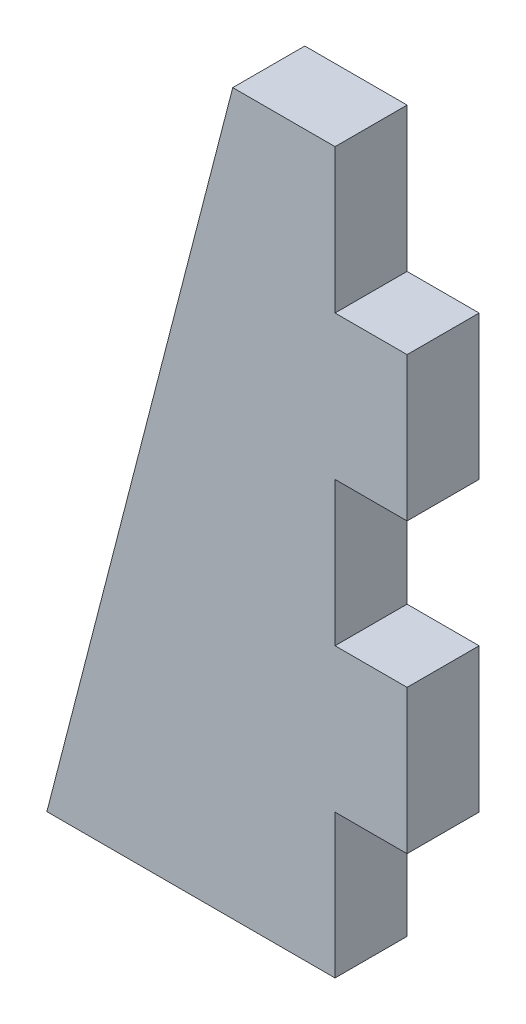
ISO-10303-21;
HEADER;
FILE_DESCRIPTION(('STEP AP214'),'2;1');
FILE_NAME('part.step','',(''),(''),'','','');
FILE_SCHEMA(('AUTOMOTIVE_DESIGN { 1 0 10303 214 1 1 1 1 }'));
ENDSEC;
DATA;
#1=APPLICATION_CONTEXT('core data for automotive mechanical design processes');
#2=APPLICATION_PROTOCOL_DEFINITION('international standard','automotive_design',2000,#1);
#3=PRODUCT_CONTEXT('',#1,'mechanical');
#4=PRODUCT('Part','Part','',(#3));
#5=PRODUCT_RELATED_PRODUCT_CATEGORY('part','',(#4));
#6=PRODUCT_DEFINITION_FORMATION('','',#4);
#7=PRODUCT_DEFINITION_CONTEXT('part definition',#1,'design');
#8=PRODUCT_DEFINITION('design','',#6,#7);
#9=PRODUCT_DEFINITION_SHAPE('','',#8);
#10=(LENGTH_UNIT() NAMED_UNIT(*) SI_UNIT(.MILLI.,.METRE.));
#11=(NAMED_UNIT(*) PLANE_ANGLE_UNIT() SI_UNIT($,.RADIAN.));
#12=(NAMED_UNIT(*) SI_UNIT($,.STERADIAN.) SOLID_ANGLE_UNIT());
#13=UNCERTAINTY_MEASURE_WITH_UNIT(LENGTH_MEASURE(1.E-05),#10,'distance_accuracy_value','');
#14=(GEOMETRIC_REPRESENTATION_CONTEXT(3) GLOBAL_UNCERTAINTY_ASSIGNED_CONTEXT((#13)) GLOBAL_UNIT_ASSIGNED_CONTEXT((#10,
#11,#12)) REPRESENTATION_CONTEXT('',''));
#15=CARTESIAN_POINT('',(0.,0.,0.));
#16=DIRECTION('',(0.,0.,1.));
#17=DIRECTION('',(1.,0.,0.));
#18=AXIS2_PLACEMENT_3D('',#15,#16,#17);
#19=CARTESIAN_POINT('',(-341.747997345156,120.472830522634,15.));
#20=DIRECTION('',(0.,-1.,0.));
#21=DIRECTION('',(0.,0.,-1.));
#22=AXIS2_PLACEMENT_3D('',#19,#20,#21);
#23=PLANE('',#22);
#24=DIRECTION('',(-1.,0.,0.));
#25=VECTOR('',#24,1.);
#26=CARTESIAN_POINT('',(-341.747997345156,120.472830522634,0.));
#27=LINE('',#26,#25);
#28=CARTESIAN_POINT('',(-320.450257694102,120.472830522634,0.));
#29=VERTEX_POINT('',#28);
#30=CARTESIAN_POINT('',(-341.747997345156,120.472830522634,0.));
#31=VERTEX_POINT('',#30);
#32=EDGE_CURVE('E157',#29,#31,#27,.T.);
#33=ORIENTED_EDGE('',*,*,#32,.T.);
#34=DIRECTION('',(0.,0.,-1.));
#35=VECTOR('',#34,1.);
#36=CARTESIAN_POINT('',(-341.747997345156,120.472830522634,15.));
#37=LINE('',#36,#35);
#38=CARTESIAN_POINT('',(-341.747997345156,120.472830522634,15.));
#39=VERTEX_POINT('',#38);
#40=EDGE_CURVE('E11',#39,#31,#37,.T.);
#41=ORIENTED_EDGE('',*,*,#40,.F.);
#42=DIRECTION('',(-1.,0.,0.));
#43=VECTOR('',#42,1.);
#44=CARTESIAN_POINT('',(-341.747997345156,120.472830522634,15.));
#45=LINE('',#44,#43);
#46=CARTESIAN_POINT('',(-320.450257694102,120.472830522634,15.));
#47=VERTEX_POINT('',#46);
#48=EDGE_CURVE('E179',#47,#39,#45,.T.);
#49=ORIENTED_EDGE('',*,*,#48,.F.);
#50=DIRECTION('',(0.,0.,-1.));
#51=VECTOR('',#50,1.);
#52=CARTESIAN_POINT('',(-320.450257694102,120.472830522634,15.));
#53=LINE('',#52,#51);
#54=EDGE_CURVE('E153',#47,#29,#53,.T.);
#55=ORIENTED_EDGE('',*,*,#54,.T.);
#56=EDGE_LOOP('',(#33,#41,#49,#55));
#57=FACE_BOUND('',#56,.T.);
#58=ADVANCED_FACE('F37',(#57),#23,.F.);
#59=CARTESIAN_POINT('',(-380.450257694102,-29.4385313207256,15.));
#60=DIRECTION('',(0.968253163708093,-0.249971620327727,0.));
#61=DIRECTION('',(0.249971620327727,0.968253163708093,0.));
#62=AXIS2_PLACEMENT_3D('',#59,#60,#61);
#63=PLANE('',#62);
#64=DIRECTION('',(-0.249971620327727,-0.968253163708093,0.));
#65=VECTOR('',#64,1.);
#66=CARTESIAN_POINT('',(-380.450257694102,-29.4385313207256,0.));
#67=LINE('',#66,#65);
#68=CARTESIAN_POINT('',(-380.450257694102,-29.4385313207256,0.));
#69=VERTEX_POINT('',#68);
#70=EDGE_CURVE('E160',#31,#69,#67,.T.);
#71=ORIENTED_EDGE('',*,*,#70,.T.);
#72=DIRECTION('',(0.,0.,-1.));
#73=VECTOR('',#72,1.);
#74=CARTESIAN_POINT('',(-380.450257694102,-29.4385313207256,15.));
#75=LINE('',#74,#73);
#76=CARTESIAN_POINT('',(-380.450257694102,-29.4385313207256,15.));
#77=VERTEX_POINT('',#76);
#78=EDGE_CURVE('E45',#77,#69,#75,.T.);
#79=ORIENTED_EDGE('',*,*,#78,.F.);
#80=DIRECTION('',(-0.249971620327727,-0.968253163708093,0.));
#81=VECTOR('',#80,1.);
#82=CARTESIAN_POINT('',(-380.450257694102,-29.4385313207256,15.));
#83=LINE('',#82,#81);
#84=EDGE_CURVE('E108',#39,#77,#83,.T.);
#85=ORIENTED_EDGE('',*,*,#84,.F.);
#86=ORIENTED_EDGE('',*,*,#40,.T.);
#87=EDGE_LOOP('',(#71,#79,#85,#86));
#88=FACE_BOUND('',#87,.T.);
#89=ADVANCED_FACE('F257',(#88),#63,.F.);
#90=CARTESIAN_POINT('',(-320.450257694102,-29.4385313207256,15.));
#91=DIRECTION('',(0.,1.,0.));
#92=DIRECTION('',(0.,0.,1.));
#93=AXIS2_PLACEMENT_3D('',#90,#91,#92);
#94=PLANE('',#93);
#95=DIRECTION('',(1.,0.,0.));
#96=VECTOR('',#95,1.);
#97=CARTESIAN_POINT('',(-320.450257694102,-29.4385313207256,0.));
#98=LINE('',#97,#96);
#99=CARTESIAN_POINT('',(-320.450257694102,-29.4385313207256,0.));
#100=VERTEX_POINT('',#99);
#101=EDGE_CURVE('E162',#69,#100,#98,.T.);
#102=ORIENTED_EDGE('',*,*,#101,.T.);
#103=DIRECTION('',(0.,0.,-1.));
#104=VECTOR('',#103,1.);
#105=CARTESIAN_POINT('',(-320.450257694102,-29.4385313207256,15.));
#106=LINE('',#105,#104);
#107=CARTESIAN_POINT('',(-320.450257694102,-29.4385313207256,15.));
#108=VERTEX_POINT('',#107);
#109=EDGE_CURVE('E198',#108,#100,#106,.T.);
#110=ORIENTED_EDGE('',*,*,#109,.F.);
#111=DIRECTION('',(1.,0.,0.));
#112=VECTOR('',#111,1.);
#113=CARTESIAN_POINT('',(-320.450257694102,-29.4385313207256,15.));
#114=LINE('',#113,#112);
#115=EDGE_CURVE('E206',#77,#108,#114,.T.);
#116=ORIENTED_EDGE('',*,*,#115,.F.);
#117=ORIENTED_EDGE('',*,*,#78,.T.);
#118=EDGE_LOOP('',(#102,#110,#116,#117));
#119=FACE_BOUND('',#118,.T.);
#120=ADVANCED_FACE('F204',(#119),#94,.F.);
#121=CARTESIAN_POINT('',(-320.450257694102,0.472830722446728,15.));
#122=DIRECTION('',(-1.,0.,0.));
#123=DIRECTION('',(0.,0.,1.));
#124=AXIS2_PLACEMENT_3D('',#121,#122,#123);
#125=PLANE('',#124);
#126=DIRECTION('',(0.,1.,0.));
#127=VECTOR('',#126,1.);
#128=CARTESIAN_POINT('',(-320.450257694102,0.472830722446728,0.));
#129=LINE('',#128,#127);
#130=CARTESIAN_POINT('',(-320.450257694102,0.472830722446728,0.));
#131=VERTEX_POINT('',#130);
#132=EDGE_CURVE('E164',#100,#131,#129,.T.);
#133=ORIENTED_EDGE('',*,*,#132,.T.);
#134=DIRECTION('',(0.,0.,-1.));
#135=VECTOR('',#134,1.);
#136=CARTESIAN_POINT('',(-320.450257694102,0.472830722446728,15.));
#137=LINE('',#136,#135);
#138=CARTESIAN_POINT('',(-320.450257694102,0.472830722446728,15.));
#139=VERTEX_POINT('',#138);
#140=EDGE_CURVE('E195',#139,#131,#137,.T.);
#141=ORIENTED_EDGE('',*,*,#140,.F.);
#142=DIRECTION('',(0.,1.,0.));
#143=VECTOR('',#142,1.);
#144=CARTESIAN_POINT('',(-320.450257694102,0.472830722446728,15.));
#145=LINE('',#144,#143);
#146=EDGE_CURVE('E224',#108,#139,#145,.T.);
#147=ORIENTED_EDGE('',*,*,#146,.F.);
#148=ORIENTED_EDGE('',*,*,#109,.T.);
#149=EDGE_LOOP('',(#133,#141,#147,#148));
#150=FACE_BOUND('',#149,.T.);
#151=ADVANCED_FACE('F215',(#150),#125,.F.);
#152=CARTESIAN_POINT('',(-305.450257694102,0.472830722446728,15.));
#153=DIRECTION('',(0.,1.,0.));
#154=DIRECTION('',(0.,0.,1.));
#155=AXIS2_PLACEMENT_3D('',#152,#153,#154);
#156=PLANE('',#155);
#157=DIRECTION('',(1.,0.,0.));
#158=VECTOR('',#157,1.);
#159=CARTESIAN_POINT('',(-305.450257694102,0.472830722446728,0.));
#160=LINE('',#159,#158);
#161=CARTESIAN_POINT('',(-305.450257694102,0.472830722446728,0.));
#162=VERTEX_POINT('',#161);
#163=EDGE_CURVE('E166',#131,#162,#160,.T.);
#164=ORIENTED_EDGE('',*,*,#163,.T.);
#165=DIRECTION('',(0.,0.,-1.));
#166=VECTOR('',#165,1.);
#167=CARTESIAN_POINT('',(-305.450257694102,0.472830722446728,15.));
#168=LINE('',#167,#166);
#169=CARTESIAN_POINT('',(-305.450257694102,0.472830722446728,15.));
#170=VERTEX_POINT('',#169);
#171=EDGE_CURVE('E192',#170,#162,#168,.T.);
#172=ORIENTED_EDGE('',*,*,#171,.F.);
#173=DIRECTION('',(1.,0.,0.));
#174=VECTOR('',#173,1.);
#175=CARTESIAN_POINT('',(-305.450257694102,0.472830722446728,15.));
#176=LINE('',#175,#174);
#177=EDGE_CURVE('E221',#139,#170,#176,.T.);
#178=ORIENTED_EDGE('',*,*,#177,.F.);
#179=ORIENTED_EDGE('',*,*,#140,.T.);
#180=EDGE_LOOP('',(#164,#172,#178,#179));
#181=FACE_BOUND('',#180,.T.);
#182=ADVANCED_FACE('F219',(#181),#156,.F.);
#183=CARTESIAN_POINT('',(-305.450257694102,30.4728307224467,15.));
#184=DIRECTION('',(-1.,0.,0.));
#185=DIRECTION('',(0.,0.,1.));
#186=AXIS2_PLACEMENT_3D('',#183,#184,#185);
#187=PLANE('',#186);
#188=DIRECTION('',(0.,1.,0.));
#189=VECTOR('',#188,1.);
#190=CARTESIAN_POINT('',(-305.450257694102,30.4728307224467,0.));
#191=LINE('',#190,#189);
#192=CARTESIAN_POINT('',(-305.450257694102,30.4728307224467,0.));
#193=VERTEX_POINT('',#192);
#194=EDGE_CURVE('E168',#162,#193,#191,.T.);
#195=ORIENTED_EDGE('',*,*,#194,.T.);
#196=DIRECTION('',(0.,0.,-1.));
#197=VECTOR('',#196,1.);
#198=CARTESIAN_POINT('',(-305.450257694102,30.4728307224467,15.));
#199=LINE('',#198,#197);
#200=CARTESIAN_POINT('',(-305.450257694102,30.4728307224467,15.));
#201=VERTEX_POINT('',#200);
#202=EDGE_CURVE('E189',#201,#193,#199,.T.);
#203=ORIENTED_EDGE('',*,*,#202,.F.);
#204=DIRECTION('',(0.,1.,0.));
#205=VECTOR('',#204,1.);
#206=CARTESIAN_POINT('',(-305.450257694102,30.4728307224467,15.));
#207=LINE('',#206,#205);
#208=EDGE_CURVE('E223',#170,#201,#207,.T.);
#209=ORIENTED_EDGE('',*,*,#208,.F.);
#210=ORIENTED_EDGE('',*,*,#171,.T.);
#211=EDGE_LOOP('',(#195,#203,#209,#210));
#212=FACE_BOUND('',#211,.T.);
#213=ADVANCED_FACE('F270',(#212),#187,.F.);
#214=CARTESIAN_POINT('',(-320.450257694102,30.4728307224467,15.));
#215=DIRECTION('',(0.,-1.,0.));
#216=DIRECTION('',(0.,0.,-1.));
#217=AXIS2_PLACEMENT_3D('',#214,#215,#216);
#218=PLANE('',#217);
#219=DIRECTION('',(-1.,0.,0.));
#220=VECTOR('',#219,1.);
#221=CARTESIAN_POINT('',(-320.450257694102,30.4728307224467,0.));
#222=LINE('',#221,#220);
#223=CARTESIAN_POINT('',(-320.450257694102,30.4728307224467,0.));
#224=VERTEX_POINT('',#223);
#225=EDGE_CURVE('E170',#193,#224,#222,.T.);
#226=ORIENTED_EDGE('',*,*,#225,.T.);
#227=DIRECTION('',(0.,0.,-1.));
#228=VECTOR('',#227,1.);
#229=CARTESIAN_POINT('',(-320.450257694102,30.4728307224467,15.));
#230=LINE('',#229,#228);
#231=CARTESIAN_POINT('',(-320.450257694102,30.4728307224467,15.));
#232=VERTEX_POINT('',#231);
#233=EDGE_CURVE('E186',#232,#224,#230,.T.);
#234=ORIENTED_EDGE('',*,*,#233,.F.);
#235=DIRECTION('',(-1.,0.,0.));
#236=VECTOR('',#235,1.);
#237=CARTESIAN_POINT('',(-320.450257694102,30.4728307224467,15.));
#238=LINE('',#237,#236);
#239=EDGE_CURVE('E226',#201,#232,#238,.T.);
#240=ORIENTED_EDGE('',*,*,#239,.F.);
#241=ORIENTED_EDGE('',*,*,#202,.T.);
#242=EDGE_LOOP('',(#226,#234,#240,#241));
#243=FACE_BOUND('',#242,.T.);
#244=ADVANCED_FACE('F273',(#243),#218,.F.);
#245=CARTESIAN_POINT('',(-320.450257694102,60.4728306259378,15.));
#246=DIRECTION('',(-1.,0.,0.));
#247=DIRECTION('',(0.,0.,1.));
#248=AXIS2_PLACEMENT_3D('',#245,#246,#247);
#249=PLANE('',#248);
#250=DIRECTION('',(0.,1.,0.));
#251=VECTOR('',#250,1.);
#252=CARTESIAN_POINT('',(-320.450257694102,60.4728306259378,0.));
#253=LINE('',#252,#251);
#254=CARTESIAN_POINT('',(-320.450257694102,60.4728306259378,0.));
#255=VERTEX_POINT('',#254);
#256=EDGE_CURVE('E172',#224,#255,#253,.T.);
#257=ORIENTED_EDGE('',*,*,#256,.T.);
#258=DIRECTION('',(0.,0.,-1.));
#259=VECTOR('',#258,1.);
#260=CARTESIAN_POINT('',(-320.450257694102,60.4728306259378,15.));
#261=LINE('',#260,#259);
#262=CARTESIAN_POINT('',(-320.450257694102,60.4728306259378,15.));
#263=VERTEX_POINT('',#262);
#264=EDGE_CURVE('E183',#263,#255,#261,.T.);
#265=ORIENTED_EDGE('',*,*,#264,.F.);
#266=DIRECTION('',(0.,1.,0.));
#267=VECTOR('',#266,1.);
#268=CARTESIAN_POINT('',(-320.450257694102,60.4728306259378,15.));
#269=LINE('',#268,#267);
#270=EDGE_CURVE('E232',#232,#263,#269,.T.);
#271=ORIENTED_EDGE('',*,*,#270,.F.);
#272=ORIENTED_EDGE('',*,*,#233,.T.);
#273=EDGE_LOOP('',(#257,#265,#271,#272));
#274=FACE_BOUND('',#273,.T.);
#275=ADVANCED_FACE('F238',(#274),#249,.F.);
#276=CARTESIAN_POINT('',(-305.450257694102,60.4728306259378,15.));
#277=DIRECTION('',(0.,1.,0.));
#278=DIRECTION('',(0.,0.,1.));
#279=AXIS2_PLACEMENT_3D('',#276,#277,#278);
#280=PLANE('',#279);
#281=DIRECTION('',(1.,0.,0.));
#282=VECTOR('',#281,1.);
#283=CARTESIAN_POINT('',(-305.450257694102,60.4728306259378,0.));
#284=LINE('',#283,#282);
#285=CARTESIAN_POINT('',(-305.450257694102,60.4728306259378,0.));
#286=VERTEX_POINT('',#285);
#287=EDGE_CURVE('E174',#255,#286,#284,.T.);
#288=ORIENTED_EDGE('',*,*,#287,.T.);
#289=DIRECTION('',(0.,0.,-1.));
#290=VECTOR('',#289,1.);
#291=CARTESIAN_POINT('',(-305.450257694102,60.4728306259378,15.));
#292=LINE('',#291,#290);
#293=CARTESIAN_POINT('',(-305.450257694102,60.4728306259378,15.));
#294=VERTEX_POINT('',#293);
#295=EDGE_CURVE('E148',#294,#286,#292,.T.);
#296=ORIENTED_EDGE('',*,*,#295,.F.);
#297=DIRECTION('',(1.,0.,0.));
#298=VECTOR('',#297,1.);
#299=CARTESIAN_POINT('',(-305.450257694102,60.4728306259378,15.));
#300=LINE('',#299,#298);
#301=EDGE_CURVE('E139',#263,#294,#300,.T.);
#302=ORIENTED_EDGE('',*,*,#301,.F.);
#303=ORIENTED_EDGE('',*,*,#264,.T.);
#304=EDGE_LOOP('',(#288,#296,#302,#303));
#305=FACE_BOUND('',#304,.T.);
#306=ADVANCED_FACE('F242',(#305),#280,.F.);
#307=CARTESIAN_POINT('',(-305.450257694102,90.4728306259378,15.));
#308=DIRECTION('',(-1.,0.,0.));
#309=DIRECTION('',(0.,0.,1.));
#310=AXIS2_PLACEMENT_3D('',#307,#308,#309);
#311=PLANE('',#310);
#312=DIRECTION('',(0.,1.,0.));
#313=VECTOR('',#312,1.);
#314=CARTESIAN_POINT('',(-305.450257694102,90.4728306259378,0.));
#315=LINE('',#314,#313);
#316=CARTESIAN_POINT('',(-305.450257694102,90.4728306259378,0.));
#317=VERTEX_POINT('',#316);
#318=EDGE_CURVE('E147',#286,#317,#315,.T.);
#319=ORIENTED_EDGE('',*,*,#318,.T.);
#320=DIRECTION('',(0.,0.,-1.));
#321=VECTOR('',#320,1.);
#322=CARTESIAN_POINT('',(-305.450257694102,90.4728306259378,15.));
#323=LINE('',#322,#321);
#324=CARTESIAN_POINT('',(-305.450257694102,90.4728306259378,15.));
#325=VERTEX_POINT('',#324);
#326=EDGE_CURVE('E144',#325,#317,#323,.T.);
#327=ORIENTED_EDGE('',*,*,#326,.F.);
#328=DIRECTION('',(0.,1.,0.));
#329=VECTOR('',#328,1.);
#330=CARTESIAN_POINT('',(-305.450257694102,90.4728306259378,15.));
#331=LINE('',#330,#329);
#332=EDGE_CURVE('E133',#294,#325,#331,.T.);
#333=ORIENTED_EDGE('',*,*,#332,.F.);
#334=ORIENTED_EDGE('',*,*,#295,.T.);
#335=EDGE_LOOP('',(#319,#327,#333,#334));
#336=FACE_BOUND('',#335,.T.);
#337=ADVANCED_FACE('F145',(#336),#311,.F.);
#338=CARTESIAN_POINT('',(-320.450257694102,90.4728306259378,15.));
#339=DIRECTION('',(0.,-1.,0.));
#340=DIRECTION('',(0.,0.,-1.));
#341=AXIS2_PLACEMENT_3D('',#338,#339,#340);
#342=PLANE('',#341);
#343=DIRECTION('',(-1.,0.,0.));
#344=VECTOR('',#343,1.);
#345=CARTESIAN_POINT('',(-320.450257694102,90.4728306259378,0.));
#346=LINE('',#345,#344);
#347=CARTESIAN_POINT('',(-320.450257694102,90.4728306259378,0.));
#348=VERTEX_POINT('',#347);
#349=EDGE_CURVE('E94',#317,#348,#346,.T.);
#350=ORIENTED_EDGE('',*,*,#349,.T.);
#351=DIRECTION('',(0.,0.,-1.));
#352=VECTOR('',#351,1.);
#353=CARTESIAN_POINT('',(-320.450257694102,90.4728306259378,15.));
#354=LINE('',#353,#352);
#355=CARTESIAN_POINT('',(-320.450257694102,90.4728306259378,15.));
#356=VERTEX_POINT('',#355);
#357=EDGE_CURVE('E149',#356,#348,#354,.T.);
#358=ORIENTED_EDGE('',*,*,#357,.F.);
#359=DIRECTION('',(-1.,0.,0.));
#360=VECTOR('',#359,1.);
#361=CARTESIAN_POINT('',(-320.450257694102,90.4728306259378,15.));
#362=LINE('',#361,#360);
#363=EDGE_CURVE('E137',#325,#356,#362,.T.);
#364=ORIENTED_EDGE('',*,*,#363,.F.);
#365=ORIENTED_EDGE('',*,*,#326,.T.);
#366=EDGE_LOOP('',(#350,#358,#364,#365));
#367=FACE_BOUND('',#366,.T.);
#368=ADVANCED_FACE('F151',(#367),#342,.F.);
#369=CARTESIAN_POINT('',(-320.450257694102,120.472830522634,15.));
#370=DIRECTION('',(-1.,0.,0.));
#371=DIRECTION('',(0.,0.,1.));
#372=AXIS2_PLACEMENT_3D('',#369,#370,#371);
#373=PLANE('',#372);
#374=DIRECTION('',(0.,1.,0.));
#375=VECTOR('',#374,1.);
#376=CARTESIAN_POINT('',(-320.450257694102,120.472830522634,0.));
#377=LINE('',#376,#375);
#378=EDGE_CURVE('E100',#348,#29,#377,.T.);
#379=ORIENTED_EDGE('',*,*,#378,.T.);
#380=ORIENTED_EDGE('',*,*,#54,.F.);
#381=DIRECTION('',(0.,1.,0.));
#382=VECTOR('',#381,1.);
#383=CARTESIAN_POINT('',(-320.450257694102,120.472830522634,15.));
#384=LINE('',#383,#382);
#385=EDGE_CURVE('E53',#356,#47,#384,.T.);
#386=ORIENTED_EDGE('',*,*,#385,.F.);
#387=ORIENTED_EDGE('',*,*,#357,.T.);
#388=EDGE_LOOP('',(#379,#380,#386,#387));
#389=FACE_BOUND('',#388,.T.);
#390=ADVANCED_FACE('F246',(#389),#373,.F.);
#391=CARTESIAN_POINT('',(0.,0.,15.));
#392=DIRECTION('',(0.,0.,-1.));
#393=DIRECTION('',(-1.,0.,0.));
#394=AXIS2_PLACEMENT_3D('',#391,#392,#393);
#395=PLANE('',#394);
#396=ORIENTED_EDGE('',*,*,#48,.T.);
#397=ORIENTED_EDGE('',*,*,#84,.T.);
#398=ORIENTED_EDGE('',*,*,#115,.T.);
#399=ORIENTED_EDGE('',*,*,#146,.T.);
#400=ORIENTED_EDGE('',*,*,#177,.T.);
#401=ORIENTED_EDGE('',*,*,#208,.T.);
#402=ORIENTED_EDGE('',*,*,#239,.T.);
#403=ORIENTED_EDGE('',*,*,#270,.T.);
#404=ORIENTED_EDGE('',*,*,#301,.T.);
#405=ORIENTED_EDGE('',*,*,#332,.T.);
#406=ORIENTED_EDGE('',*,*,#363,.T.);
#407=ORIENTED_EDGE('',*,*,#385,.T.);
#408=EDGE_LOOP('',(#396,#397,#398,#399,#400,#401,#402,#403,#404,#405,#406,#407));
#409=FACE_BOUND('',#408,.T.);
#410=ADVANCED_FACE('F135',(#409),#395,.F.);
#411=CARTESIAN_POINT('',(0.,0.,0.));
#412=DIRECTION('',(0.,0.,-1.));
#413=DIRECTION('',(-1.,0.,0.));
#414=AXIS2_PLACEMENT_3D('',#411,#412,#413);
#415=PLANE('',#414);
#416=ORIENTED_EDGE('',*,*,#32,.F.);
#417=ORIENTED_EDGE('',*,*,#378,.F.);
#418=ORIENTED_EDGE('',*,*,#349,.F.);
#419=ORIENTED_EDGE('',*,*,#318,.F.);
#420=ORIENTED_EDGE('',*,*,#287,.F.);
#421=ORIENTED_EDGE('',*,*,#256,.F.);
#422=ORIENTED_EDGE('',*,*,#225,.F.);
#423=ORIENTED_EDGE('',*,*,#194,.F.);
#424=ORIENTED_EDGE('',*,*,#163,.F.);
#425=ORIENTED_EDGE('',*,*,#132,.F.);
#426=ORIENTED_EDGE('',*,*,#101,.F.);
#427=ORIENTED_EDGE('',*,*,#70,.F.);
#428=EDGE_LOOP('',(#416,#417,#418,#419,#420,#421,#422,#423,#424,#425,#426,#427));
#429=FACE_BOUND('',#428,.T.);
#430=ADVANCED_FACE('F210',(#429),#415,.T.);
#431=CLOSED_SHELL('',(#58,#89,#120,#151,#182,#213,#244,#275,#306,#337,#368,#390,#410,#430));
#432=MANIFOLD_SOLID_BREP('B2',#431);
#433=ADVANCED_BREP_SHAPE_REPRESENTATION('',(#18,#432),#14);
#434=SHAPE_DEFINITION_REPRESENTATION(#9,#433);
ENDSEC;
END-ISO-10303-21;
